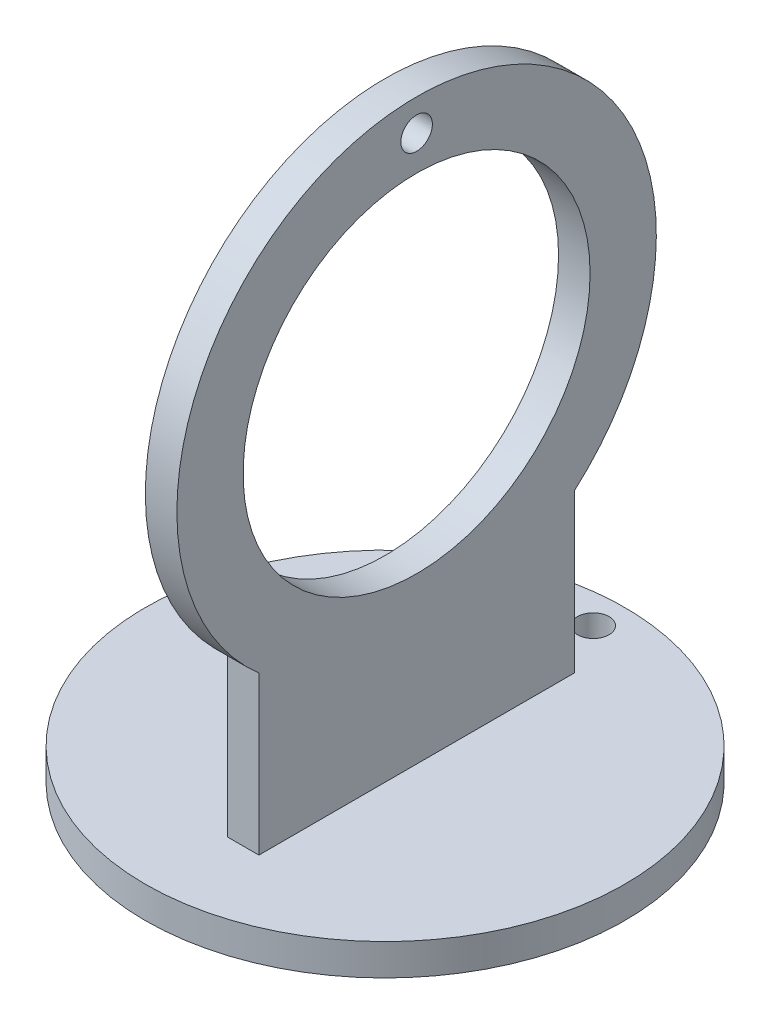
ISO-10303-21;
HEADER;
FILE_DESCRIPTION(('STEP AP214'),'2;1');
FILE_NAME('part.step','',(''),(''),'','','');
FILE_SCHEMA(('AUTOMOTIVE_DESIGN { 1 0 10303 214 1 1 1 1 }'));
ENDSEC;
DATA;
#1=APPLICATION_CONTEXT('core data for automotive mechanical design processes');
#2=APPLICATION_PROTOCOL_DEFINITION('international standard','automotive_design',2000,#1);
#3=PRODUCT_CONTEXT('',#1,'mechanical');
#4=PRODUCT('Part','Part','',(#3));
#5=PRODUCT_RELATED_PRODUCT_CATEGORY('part','',(#4));
#6=PRODUCT_DEFINITION_FORMATION('','',#4);
#7=PRODUCT_DEFINITION_CONTEXT('part definition',#1,'design');
#8=PRODUCT_DEFINITION('design','',#6,#7);
#9=PRODUCT_DEFINITION_SHAPE('','',#8);
#10=(LENGTH_UNIT() NAMED_UNIT(*) SI_UNIT(.MILLI.,.METRE.));
#11=(NAMED_UNIT(*) PLANE_ANGLE_UNIT() SI_UNIT($,.RADIAN.));
#12=(NAMED_UNIT(*) SI_UNIT($,.STERADIAN.) SOLID_ANGLE_UNIT());
#13=UNCERTAINTY_MEASURE_WITH_UNIT(LENGTH_MEASURE(1.E-05),#10,'distance_accuracy_value','');
#14=(GEOMETRIC_REPRESENTATION_CONTEXT(3) GLOBAL_UNCERTAINTY_ASSIGNED_CONTEXT((#13)) GLOBAL_UNIT_ASSIGNED_CONTEXT((#10,
#11,#12)) REPRESENTATION_CONTEXT('',''));
#15=CARTESIAN_POINT('',(0.,0.,0.));
#16=DIRECTION('',(0.,0.,1.));
#17=DIRECTION('',(1.,0.,0.));
#18=AXIS2_PLACEMENT_3D('',#15,#16,#17);
#19=CARTESIAN_POINT('',(0.,5.,0.));
#20=DIRECTION('',(0.,1.,0.));
#21=DIRECTION('',(0.,0.,1.));
#22=AXIS2_PLACEMENT_3D('',#19,#20,#21);
#23=PLANE('',#22);
#24=CARTESIAN_POINT('',(0.,5.,0.));
#25=DIRECTION('',(0.,1.,0.));
#26=DIRECTION('',(0.,0.,1.));
#27=AXIS2_PLACEMENT_3D('',#24,#25,#26);
#28=CIRCLE('',#27,38.);
#29=CARTESIAN_POINT('',(0.,5.,38.));
#30=VERTEX_POINT('',#29);
#31=EDGE_CURVE('E11',#30,#30,#28,.T.);
#32=ORIENTED_EDGE('',*,*,#31,.T.);
#33=EDGE_LOOP('',(#32));
#34=FACE_BOUND('',#33,.T.);
#35=CARTESIAN_POINT('',(0.,5.,-33.));
#36=DIRECTION('',(0.,1.,0.));
#37=DIRECTION('',(0.,0.,1.));
#38=AXIS2_PLACEMENT_3D('',#35,#36,#37);
#39=CIRCLE('',#38,2.5);
#40=CARTESIAN_POINT('',(0.,5.,-30.5));
#41=VERTEX_POINT('',#40);
#42=EDGE_CURVE('E125',#41,#41,#39,.T.);
#43=ORIENTED_EDGE('',*,*,#42,.F.);
#44=EDGE_LOOP('',(#43));
#45=FACE_BOUND('',#44,.T.);
#46=DIRECTION('',(0.,0.,-1.));
#47=VECTOR('',#46,1.);
#48=CARTESIAN_POINT('',(0.,5.,25.));
#49=LINE('',#48,#47);
#50=CARTESIAN_POINT('',(0.,5.,25.));
#51=VERTEX_POINT('',#50);
#52=CARTESIAN_POINT('',(0.,5.,-25.));
#53=VERTEX_POINT('',#52);
#54=EDGE_CURVE('E58',#51,#53,#49,.T.);
#55=ORIENTED_EDGE('',*,*,#54,.T.);
#56=DIRECTION('',(-1.,0.,0.));
#57=VECTOR('',#56,1.);
#58=CARTESIAN_POINT('',(5.,5.,-25.));
#59=LINE('',#58,#57);
#60=CARTESIAN_POINT('',(5.,5.,-25.));
#61=VERTEX_POINT('',#60);
#62=EDGE_CURVE('E84',#61,#53,#59,.T.);
#63=ORIENTED_EDGE('',*,*,#62,.F.);
#64=DIRECTION('',(0.,0.,-1.));
#65=VECTOR('',#64,1.);
#66=CARTESIAN_POINT('',(5.,5.,25.));
#67=LINE('',#66,#65);
#68=CARTESIAN_POINT('',(5.,5.,25.));
#69=VERTEX_POINT('',#68);
#70=EDGE_CURVE('E67',#69,#61,#67,.T.);
#71=ORIENTED_EDGE('',*,*,#70,.F.);
#72=DIRECTION('',(-1.,0.,0.));
#73=VECTOR('',#72,1.);
#74=CARTESIAN_POINT('',(5.,5.,25.));
#75=LINE('',#74,#73);
#76=EDGE_CURVE('E106',#69,#51,#75,.T.);
#77=ORIENTED_EDGE('',*,*,#76,.T.);
#78=EDGE_LOOP('',(#55,#63,#71,#77));
#79=FACE_BOUND('',#78,.T.);
#80=ADVANCED_FACE('F43',(#34,#45,#79),#23,.T.);
#81=CARTESIAN_POINT('',(0.,0.,0.));
#82=DIRECTION('',(0.,1.,0.));
#83=DIRECTION('',(0.,0.,1.));
#84=AXIS2_PLACEMENT_3D('',#81,#82,#83);
#85=PLANE('',#84);
#86=CARTESIAN_POINT('',(0.,0.,0.));
#87=DIRECTION('',(0.,1.,0.));
#88=DIRECTION('',(0.,0.,1.));
#89=AXIS2_PLACEMENT_3D('',#86,#87,#88);
#90=CIRCLE('',#89,38.);
#91=CARTESIAN_POINT('',(0.,0.,38.));
#92=VERTEX_POINT('',#91);
#93=EDGE_CURVE('E47',#92,#92,#90,.T.);
#94=ORIENTED_EDGE('',*,*,#93,.F.);
#95=EDGE_LOOP('',(#94));
#96=FACE_BOUND('',#95,.T.);
#97=CARTESIAN_POINT('',(0.,0.,-33.));
#98=DIRECTION('',(0.,1.,0.));
#99=DIRECTION('',(0.,0.,1.));
#100=AXIS2_PLACEMENT_3D('',#97,#98,#99);
#101=CIRCLE('',#100,2.5);
#102=CARTESIAN_POINT('',(0.,0.,-30.5));
#103=VERTEX_POINT('',#102);
#104=EDGE_CURVE('E124',#103,#103,#101,.T.);
#105=ORIENTED_EDGE('',*,*,#104,.T.);
#106=EDGE_LOOP('',(#105));
#107=FACE_BOUND('',#106,.T.);
#108=ADVANCED_FACE('F131',(#96,#107),#85,.F.);
#109=CARTESIAN_POINT('',(0.,5.,0.));
#110=DIRECTION('',(0.,-1.,0.));
#111=DIRECTION('',(0.,0.,-1.));
#112=AXIS2_PLACEMENT_3D('',#109,#110,#111);
#113=CYLINDRICAL_SURFACE('',#112,38.);
#114=ORIENTED_EDGE('',*,*,#31,.F.);
#115=EDGE_LOOP('',(#114));
#116=FACE_BOUND('',#115,.T.);
#117=ORIENTED_EDGE('',*,*,#93,.T.);
#118=EDGE_LOOP('',(#117));
#119=FACE_BOUND('',#118,.T.);
#120=ADVANCED_FACE('F45',(#116,#119),#113,.T.);
#121=CARTESIAN_POINT('',(0.,5.,-33.));
#122=DIRECTION('',(0.,-1.,0.));
#123=DIRECTION('',(0.,0.,-1.));
#124=AXIS2_PLACEMENT_3D('',#121,#122,#123);
#125=CYLINDRICAL_SURFACE('',#124,2.5);
#126=ORIENTED_EDGE('',*,*,#42,.T.);
#127=EDGE_LOOP('',(#126));
#128=FACE_BOUND('',#127,.T.);
#129=ORIENTED_EDGE('',*,*,#104,.F.);
#130=EDGE_LOOP('',(#129));
#131=FACE_BOUND('',#130,.T.);
#132=ADVANCED_FACE('F133',(#128,#131),#125,.F.);
#133=CARTESIAN_POINT('',(5.,58.6181760425084,0.));
#134=DIRECTION('',(1.,0.,0.));
#135=DIRECTION('',(0.,0.,-1.));
#136=AXIS2_PLACEMENT_3D('',#133,#134,#135);
#137=PLANE('',#136);
#138=CARTESIAN_POINT('',(5.,58.6181760425084,0.));
#139=DIRECTION('',(1.,0.,0.));
#140=DIRECTION('',(0.,0.,-1.));
#141=AXIS2_PLACEMENT_3D('',#138,#139,#140);
#142=CIRCLE('',#141,27.5);
#143=CARTESIAN_POINT('',(5.,58.6181760425084,-27.5));
#144=VERTEX_POINT('',#143);
#145=EDGE_CURVE('E256',#144,#144,#142,.T.);
#146=ORIENTED_EDGE('',*,*,#145,.F.);
#147=EDGE_LOOP('',(#146));
#148=FACE_BOUND('',#147,.T.);
#149=DIRECTION('',(0.,1.,0.));
#150=VECTOR('',#149,1.);
#151=CARTESIAN_POINT('',(5.,30.,-25.));
#152=LINE('',#151,#150);
#153=CARTESIAN_POINT('',(5.,30.,-25.));
#154=VERTEX_POINT('',#153);
#155=EDGE_CURVE('E97',#61,#154,#152,.T.);
#156=ORIENTED_EDGE('',*,*,#155,.T.);
#157=CARTESIAN_POINT('',(5.,58.6181760425084,0.));
#158=DIRECTION('',(1.,0.,0.));
#159=DIRECTION('',(0.,0.,-1.));
#160=AXIS2_PLACEMENT_3D('',#157,#158,#159);
#161=CIRCLE('',#160,38.);
#162=CARTESIAN_POINT('',(5.,30.,25.));
#163=VERTEX_POINT('',#162);
#164=EDGE_CURVE('E91',#154,#163,#161,.T.);
#165=ORIENTED_EDGE('',*,*,#164,.T.);
#166=DIRECTION('',(0.,-1.,0.));
#167=VECTOR('',#166,1.);
#168=CARTESIAN_POINT('',(5.,30.,25.));
#169=LINE('',#168,#167);
#170=EDGE_CURVE('E95',#163,#69,#169,.T.);
#171=ORIENTED_EDGE('',*,*,#170,.T.);
#172=ORIENTED_EDGE('',*,*,#70,.T.);
#173=EDGE_LOOP('',(#156,#165,#171,#172));
#174=FACE_BOUND('',#173,.T.);
#175=CARTESIAN_POINT('',(5.,91.6181760425084,0.));
#176=DIRECTION('',(1.,0.,0.));
#177=DIRECTION('',(0.,0.,-1.));
#178=AXIS2_PLACEMENT_3D('',#175,#176,#177);
#179=CIRCLE('',#178,2.5);
#180=CARTESIAN_POINT('',(5.,91.6181760425084,-2.49999999999999));
#181=VERTEX_POINT('',#180);
#182=EDGE_CURVE('E116',#181,#181,#179,.T.);
#183=ORIENTED_EDGE('',*,*,#182,.F.);
#184=EDGE_LOOP('',(#183));
#185=FACE_BOUND('',#184,.T.);
#186=ADVANCED_FACE('F92',(#148,#174,#185),#137,.T.);
#187=CARTESIAN_POINT('',(0.,58.6181760425084,0.));
#188=DIRECTION('',(1.,0.,0.));
#189=DIRECTION('',(0.,0.,-1.));
#190=AXIS2_PLACEMENT_3D('',#187,#188,#189);
#191=PLANE('',#190);
#192=CARTESIAN_POINT('',(0.,58.6181760425084,0.));
#193=DIRECTION('',(1.,0.,0.));
#194=DIRECTION('',(0.,0.,-1.));
#195=AXIS2_PLACEMENT_3D('',#192,#193,#194);
#196=CIRCLE('',#195,27.5);
#197=CARTESIAN_POINT('',(0.,58.6181760425084,-27.5));
#198=VERTEX_POINT('',#197);
#199=EDGE_CURVE('E259',#198,#198,#196,.F.);
#200=ORIENTED_EDGE('',*,*,#199,.F.);
#201=EDGE_LOOP('',(#200));
#202=FACE_BOUND('',#201,.T.);
#203=DIRECTION('',(0.,1.,0.));
#204=VECTOR('',#203,1.);
#205=CARTESIAN_POINT('',(0.,30.,-25.));
#206=LINE('',#205,#204);
#207=CARTESIAN_POINT('',(0.,30.,-25.));
#208=VERTEX_POINT('',#207);
#209=EDGE_CURVE('E114',#53,#208,#206,.T.);
#210=ORIENTED_EDGE('',*,*,#209,.F.);
#211=ORIENTED_EDGE('',*,*,#54,.F.);
#212=DIRECTION('',(0.,-1.,0.));
#213=VECTOR('',#212,1.);
#214=CARTESIAN_POINT('',(0.,30.,25.));
#215=LINE('',#214,#213);
#216=CARTESIAN_POINT('',(0.,30.,25.));
#217=VERTEX_POINT('',#216);
#218=EDGE_CURVE('E118',#217,#51,#215,.T.);
#219=ORIENTED_EDGE('',*,*,#218,.F.);
#220=CARTESIAN_POINT('',(0.,58.6181760425084,0.));
#221=DIRECTION('',(1.,0.,0.));
#222=DIRECTION('',(0.,0.,-1.));
#223=AXIS2_PLACEMENT_3D('',#220,#221,#222);
#224=CIRCLE('',#223,38.);
#225=EDGE_CURVE('E103',#208,#217,#224,.T.);
#226=ORIENTED_EDGE('',*,*,#225,.F.);
#227=EDGE_LOOP('',(#210,#211,#219,#226));
#228=FACE_BOUND('',#227,.T.);
#229=CARTESIAN_POINT('',(0.,91.6181760425084,0.));
#230=DIRECTION('',(1.,0.,0.));
#231=DIRECTION('',(0.,0.,-1.));
#232=AXIS2_PLACEMENT_3D('',#229,#230,#231);
#233=CIRCLE('',#232,2.5);
#234=CARTESIAN_POINT('',(0.,91.6181760425084,-2.49999999999999));
#235=VERTEX_POINT('',#234);
#236=EDGE_CURVE('E260',#235,#235,#233,.T.);
#237=ORIENTED_EDGE('',*,*,#236,.T.);
#238=EDGE_LOOP('',(#237));
#239=FACE_BOUND('',#238,.T.);
#240=ADVANCED_FACE('F141',(#202,#228,#239),#191,.F.);
#241=CARTESIAN_POINT('',(5.,30.,-25.));
#242=DIRECTION('',(0.,0.,1.));
#243=DIRECTION('',(0.,-1.,0.));
#244=AXIS2_PLACEMENT_3D('',#241,#242,#243);
#245=PLANE('',#244);
#246=ORIENTED_EDGE('',*,*,#209,.T.);
#247=DIRECTION('',(-1.,0.,0.));
#248=VECTOR('',#247,1.);
#249=CARTESIAN_POINT('',(5.,30.,-25.));
#250=LINE('',#249,#248);
#251=EDGE_CURVE('E105',#154,#208,#250,.T.);
#252=ORIENTED_EDGE('',*,*,#251,.F.);
#253=ORIENTED_EDGE('',*,*,#155,.F.);
#254=ORIENTED_EDGE('',*,*,#62,.T.);
#255=EDGE_LOOP('',(#246,#252,#253,#254));
#256=FACE_BOUND('',#255,.T.);
#257=ADVANCED_FACE('F182',(#256),#245,.F.);
#258=CARTESIAN_POINT('',(5.,58.6181760425084,0.));
#259=DIRECTION('',(-1.,0.,0.));
#260=DIRECTION('',(0.,0.,1.));
#261=AXIS2_PLACEMENT_3D('',#258,#259,#260);
#262=CYLINDRICAL_SURFACE('',#261,38.);
#263=ORIENTED_EDGE('',*,*,#225,.T.);
#264=DIRECTION('',(-1.,0.,0.));
#265=VECTOR('',#264,1.);
#266=CARTESIAN_POINT('',(5.,30.,25.));
#267=LINE('',#266,#265);
#268=EDGE_CURVE('E101',#163,#217,#267,.T.);
#269=ORIENTED_EDGE('',*,*,#268,.F.);
#270=ORIENTED_EDGE('',*,*,#164,.F.);
#271=ORIENTED_EDGE('',*,*,#251,.T.);
#272=EDGE_LOOP('',(#263,#269,#270,#271));
#273=FACE_BOUND('',#272,.T.);
#274=ADVANCED_FACE('F102',(#273),#262,.T.);
#275=CARTESIAN_POINT('',(5.,30.,25.));
#276=DIRECTION('',(0.,0.,-1.));
#277=DIRECTION('',(0.,1.,0.));
#278=AXIS2_PLACEMENT_3D('',#275,#276,#277);
#279=PLANE('',#278);
#280=ORIENTED_EDGE('',*,*,#218,.T.);
#281=ORIENTED_EDGE('',*,*,#76,.F.);
#282=ORIENTED_EDGE('',*,*,#170,.F.);
#283=ORIENTED_EDGE('',*,*,#268,.T.);
#284=EDGE_LOOP('',(#280,#281,#282,#283));
#285=FACE_BOUND('',#284,.T.);
#286=ADVANCED_FACE('F108',(#285),#279,.F.);
#287=CARTESIAN_POINT('',(5.,91.6181760425084,0.));
#288=DIRECTION('',(-1.,0.,0.));
#289=DIRECTION('',(0.,0.,1.));
#290=AXIS2_PLACEMENT_3D('',#287,#288,#289);
#291=CYLINDRICAL_SURFACE('',#290,2.5);
#292=ORIENTED_EDGE('',*,*,#182,.T.);
#293=EDGE_LOOP('',(#292));
#294=FACE_BOUND('',#293,.T.);
#295=ORIENTED_EDGE('',*,*,#236,.F.);
#296=EDGE_LOOP('',(#295));
#297=FACE_BOUND('',#296,.T.);
#298=ADVANCED_FACE('F206',(#294,#297),#291,.F.);
#299=CARTESIAN_POINT('',(-38.001,58.6181760425084,0.));
#300=DIRECTION('',(1.,0.,0.));
#301=DIRECTION('',(0.,0.,-1.));
#302=AXIS2_PLACEMENT_3D('',#299,#300,#301);
#303=CYLINDRICAL_SURFACE('',#302,27.5);
#304=ORIENTED_EDGE('',*,*,#145,.T.);
#305=EDGE_LOOP('',(#304));
#306=FACE_BOUND('',#305,.T.);
#307=ORIENTED_EDGE('',*,*,#199,.T.);
#308=EDGE_LOOP('',(#307));
#309=FACE_BOUND('',#308,.T.);
#310=ADVANCED_FACE('F216',(#306,#309),#303,.F.);
#311=CLOSED_SHELL('',(#80,#108,#120,#132,#186,#240,#257,#274,#286,#298,#310));
#312=MANIFOLD_SOLID_BREP('B2',#311);
#313=ADVANCED_BREP_SHAPE_REPRESENTATION('',(#18,#312),#14);
#314=SHAPE_DEFINITION_REPRESENTATION(#9,#313);
ENDSEC;
END-ISO-10303-21;
